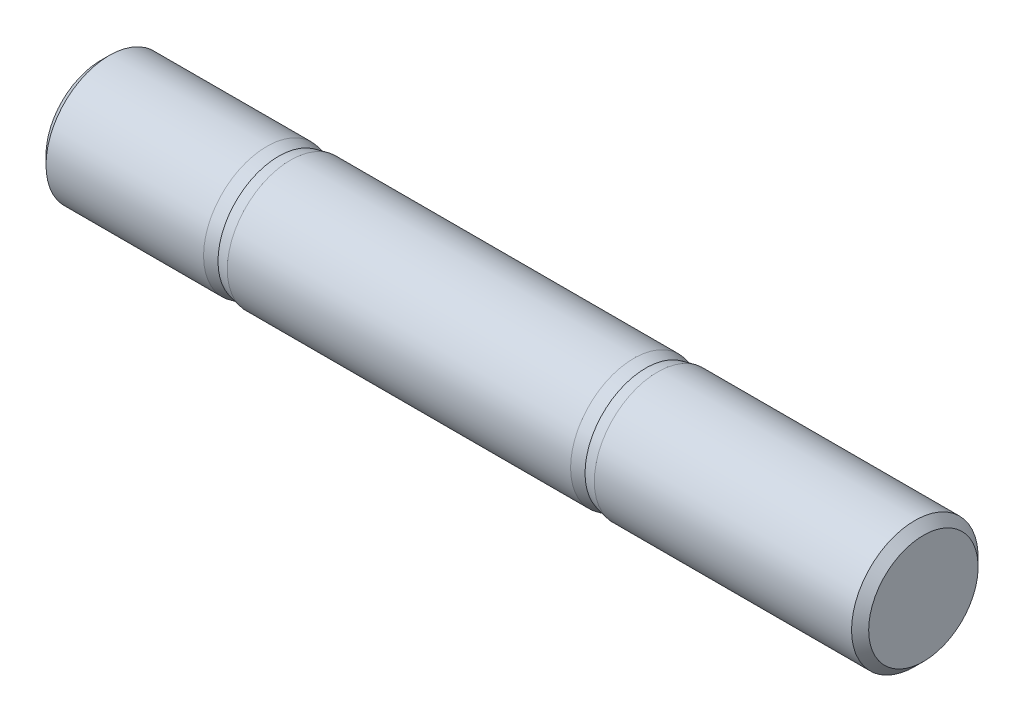
ISO-10303-21;
HEADER;
FILE_DESCRIPTION(('STEP AP214'),'2;1');
FILE_NAME('part.step','',(''),(''),'','','');
FILE_SCHEMA(('AUTOMOTIVE_DESIGN { 1 0 10303 214 1 1 1 1 }'));
ENDSEC;
DATA;
#1=APPLICATION_CONTEXT('core data for automotive mechanical design processes');
#2=APPLICATION_PROTOCOL_DEFINITION('international standard','automotive_design',2000,#1);
#3=PRODUCT_CONTEXT('',#1,'mechanical');
#4=PRODUCT('Part','Part','',(#3));
#5=PRODUCT_RELATED_PRODUCT_CATEGORY('part','',(#4));
#6=PRODUCT_DEFINITION_FORMATION('','',#4);
#7=PRODUCT_DEFINITION_CONTEXT('part definition',#1,'design');
#8=PRODUCT_DEFINITION('design','',#6,#7);
#9=PRODUCT_DEFINITION_SHAPE('','',#8);
#10=(LENGTH_UNIT() NAMED_UNIT(*) SI_UNIT(.MILLI.,.METRE.));
#11=(NAMED_UNIT(*) PLANE_ANGLE_UNIT() SI_UNIT($,.RADIAN.));
#12=(NAMED_UNIT(*) SI_UNIT($,.STERADIAN.) SOLID_ANGLE_UNIT());
#13=UNCERTAINTY_MEASURE_WITH_UNIT(LENGTH_MEASURE(1.E-05),#10,'distance_accuracy_value','');
#14=(GEOMETRIC_REPRESENTATION_CONTEXT(3) GLOBAL_UNCERTAINTY_ASSIGNED_CONTEXT((#13)) GLOBAL_UNIT_ASSIGNED_CONTEXT((#10,
#11,#12)) REPRESENTATION_CONTEXT('',''));
#15=CARTESIAN_POINT('',(0.,0.,0.));
#16=DIRECTION('',(0.,0.,1.));
#17=DIRECTION('',(1.,0.,0.));
#18=AXIS2_PLACEMENT_3D('',#15,#16,#17);
#19=CARTESIAN_POINT('',(30.,0.,0.));
#20=DIRECTION('',(-1.,0.,0.));
#21=DIRECTION('',(0.,0.,1.));
#22=AXIS2_PLACEMENT_3D('',#19,#20,#21);
#23=CONICAL_SURFACE('',#22,9.188,0.213241283902229);
#24=CARTESIAN_POINT('',(26.25,0.,0.));
#25=DIRECTION('',(-1.,0.,0.));
#26=DIRECTION('',(0.,0.,1.));
#27=AXIS2_PLACEMENT_3D('',#24,#25,#26);
#28=CIRCLE('',#27,10.);
#29=CARTESIAN_POINT('',(26.25,0.,10.));
#30=VERTEX_POINT('',#29);
#31=EDGE_CURVE('E56',#30,#30,#28,.T.);
#32=ORIENTED_EDGE('',*,*,#31,.F.);
#33=EDGE_LOOP('',(#32));
#34=FACE_BOUND('',#33,.T.);
#35=CARTESIAN_POINT('',(28.125,0.,0.));
#36=DIRECTION('',(1.,0.,0.));
#37=DIRECTION('',(0.,0.,-1.));
#38=AXIS2_PLACEMENT_3D('',#35,#36,#37);
#39=CIRCLE('',#38,9.594);
#40=CARTESIAN_POINT('',(28.125,0.,-9.594));
#41=VERTEX_POINT('',#40);
#42=EDGE_CURVE('E10',#41,#41,#39,.T.);
#43=ORIENTED_EDGE('',*,*,#42,.F.);
#44=EDGE_LOOP('',(#43));
#45=FACE_BOUND('',#44,.T.);
#46=ADVANCED_FACE('F30',(#34,#45),#23,.T.);
#47=CARTESIAN_POINT('',(0.,0.,0.));
#48=DIRECTION('',(1.,0.,0.));
#49=DIRECTION('',(0.,0.,-1.));
#50=AXIS2_PLACEMENT_3D('',#47,#48,#49);
#51=PLANE('',#50);
#52=CARTESIAN_POINT('',(0.,0.,0.));
#53=DIRECTION('',(1.,0.,0.));
#54=DIRECTION('',(0.,0.,-1.));
#55=AXIS2_PLACEMENT_3D('',#52,#53,#54);
#56=CIRCLE('',#55,8.64700000000004);
#57=CARTESIAN_POINT('',(0.,0.,-8.64700000000004));
#58=VERTEX_POINT('',#57);
#59=EDGE_CURVE('E53',#58,#58,#56,.F.);
#60=ORIENTED_EDGE('',*,*,#59,.T.);
#61=EDGE_LOOP('',(#60));
#62=FACE_BOUND('',#61,.T.);
#63=ADVANCED_FACE('F86',(#62),#51,.F.);
#64=CARTESIAN_POINT('',(-1.31084166351941,0.,0.));
#65=DIRECTION('',(-1.,0.,0.));
#66=DIRECTION('',(0.,0.,1.));
#67=AXIS2_PLACEMENT_3D('',#64,#65,#66);
#68=CYLINDRICAL_SURFACE('',#67,10.);
#69=CARTESIAN_POINT('',(1.35299999999997,0.,0.));
#70=DIRECTION('',(1.,0.,0.));
#71=DIRECTION('',(0.,0.,-1.));
#72=AXIS2_PLACEMENT_3D('',#69,#70,#71);
#73=CIRCLE('',#72,10.);
#74=CARTESIAN_POINT('',(1.35299999999997,0.,-10.));
#75=VERTEX_POINT('',#74);
#76=EDGE_CURVE('E50',#75,#75,#73,.T.);
#77=ORIENTED_EDGE('',*,*,#76,.T.);
#78=EDGE_LOOP('',(#77));
#79=FACE_BOUND('',#78,.T.);
#80=ORIENTED_EDGE('',*,*,#31,.T.);
#81=EDGE_LOOP('',(#80));
#82=FACE_BOUND('',#81,.T.);
#83=ADVANCED_FACE('F92',(#79,#82),#68,.T.);
#84=CARTESIAN_POINT('',(0.,0.,0.));
#85=DIRECTION('',(1.,0.,0.));
#86=DIRECTION('',(0.,0.,-1.));
#87=AXIS2_PLACEMENT_3D('',#84,#85,#86);
#88=CONICAL_SURFACE('',#87,8.64700000000004,0.785398163397443);
#89=ORIENTED_EDGE('',*,*,#76,.F.);
#90=EDGE_LOOP('',(#89));
#91=FACE_BOUND('',#90,.T.);
#92=ORIENTED_EDGE('',*,*,#59,.F.);
#93=EDGE_LOOP('',(#92));
#94=FACE_BOUND('',#93,.T.);
#95=ADVANCED_FACE('F82',(#91,#94),#88,.T.);
#96=CARTESIAN_POINT('',(30.,0.,0.));
#97=DIRECTION('',(1.,0.,0.));
#98=DIRECTION('',(0.,0.,-1.));
#99=AXIS2_PLACEMENT_3D('',#96,#97,#98);
#100=CONICAL_SURFACE('',#99,10.,0.213241283902229);
#101=CARTESIAN_POINT('',(30.,0.,0.));
#102=DIRECTION('',(-1.,0.,0.));
#103=DIRECTION('',(0.,0.,1.));
#104=AXIS2_PLACEMENT_3D('',#101,#102,#103);
#105=CIRCLE('',#104,10.);
#106=CARTESIAN_POINT('',(30.,0.,10.));
#107=VERTEX_POINT('',#106);
#108=EDGE_CURVE('E62',#107,#107,#105,.T.);
#109=ORIENTED_EDGE('',*,*,#108,.T.);
#110=EDGE_LOOP('',(#109));
#111=FACE_BOUND('',#110,.T.);
#112=ORIENTED_EDGE('',*,*,#42,.T.);
#113=EDGE_LOOP('',(#112));
#114=FACE_BOUND('',#113,.T.);
#115=ADVANCED_FACE('F73',(#111,#114),#100,.T.);
#116=CARTESIAN_POINT('',(88.,0.,0.));
#117=DIRECTION('',(-1.,0.,0.));
#118=DIRECTION('',(0.,0.,1.));
#119=AXIS2_PLACEMENT_3D('',#116,#117,#118);
#120=CONICAL_SURFACE('',#119,9.188,0.213241283902229);
#121=CARTESIAN_POINT('',(84.25,0.,0.));
#122=DIRECTION('',(-1.,0.,0.));
#123=DIRECTION('',(0.,0.,1.));
#124=AXIS2_PLACEMENT_3D('',#121,#122,#123);
#125=CIRCLE('',#124,10.);
#126=CARTESIAN_POINT('',(84.25,0.,10.));
#127=VERTEX_POINT('',#126);
#128=EDGE_CURVE('E65',#127,#127,#125,.T.);
#129=ORIENTED_EDGE('',*,*,#128,.F.);
#130=EDGE_LOOP('',(#129));
#131=FACE_BOUND('',#130,.T.);
#132=CARTESIAN_POINT('',(86.125,0.,0.));
#133=DIRECTION('',(-1.,0.,0.));
#134=DIRECTION('',(0.,0.,1.));
#135=AXIS2_PLACEMENT_3D('',#132,#133,#134);
#136=CIRCLE('',#135,9.594);
#137=CARTESIAN_POINT('',(86.125,0.,9.594));
#138=VERTEX_POINT('',#137);
#139=EDGE_CURVE('E37',#138,#138,#136,.T.);
#140=ORIENTED_EDGE('',*,*,#139,.T.);
#141=EDGE_LOOP('',(#140));
#142=FACE_BOUND('',#141,.T.);
#143=ADVANCED_FACE('F71',(#131,#142),#120,.T.);
#144=CARTESIAN_POINT('',(-1.31084166351941,0.,0.));
#145=DIRECTION('',(-1.,0.,0.));
#146=DIRECTION('',(0.,0.,1.));
#147=AXIS2_PLACEMENT_3D('',#144,#145,#146);
#148=CYLINDRICAL_SURFACE('',#147,10.);
#149=ORIENTED_EDGE('',*,*,#108,.F.);
#150=EDGE_LOOP('',(#149));
#151=FACE_BOUND('',#150,.T.);
#152=ORIENTED_EDGE('',*,*,#128,.T.);
#153=EDGE_LOOP('',(#152));
#154=FACE_BOUND('',#153,.T.);
#155=ADVANCED_FACE('F69',(#151,#154),#148,.T.);
#156=CARTESIAN_POINT('',(130.,10.,0.));
#157=DIRECTION('',(-1.,0.,0.));
#158=DIRECTION('',(0.,0.,1.));
#159=AXIS2_PLACEMENT_3D('',#156,#157,#158);
#160=PLANE('',#159);
#161=CARTESIAN_POINT('',(130.,0.,0.));
#162=DIRECTION('',(-1.,0.,0.));
#163=DIRECTION('',(0.,0.,1.));
#164=AXIS2_PLACEMENT_3D('',#161,#162,#163);
#165=CIRCLE('',#164,8.647);
#166=CARTESIAN_POINT('',(130.,0.,8.647));
#167=VERTEX_POINT('',#166);
#168=EDGE_CURVE('E41',#167,#167,#165,.F.);
#169=ORIENTED_EDGE('',*,*,#168,.T.);
#170=EDGE_LOOP('',(#169));
#171=FACE_BOUND('',#170,.T.);
#172=ADVANCED_FACE('F79',(#171),#160,.F.);
#173=CARTESIAN_POINT('',(128.647,0.,0.));
#174=DIRECTION('',(-1.,0.,0.));
#175=DIRECTION('',(0.,0.,1.));
#176=AXIS2_PLACEMENT_3D('',#173,#174,#175);
#177=CONICAL_SURFACE('',#176,10.,0.785398163397441);
#178=ORIENTED_EDGE('',*,*,#168,.F.);
#179=EDGE_LOOP('',(#178));
#180=FACE_BOUND('',#179,.T.);
#181=CARTESIAN_POINT('',(128.647,0.,0.));
#182=DIRECTION('',(-1.,0.,0.));
#183=DIRECTION('',(0.,0.,1.));
#184=AXIS2_PLACEMENT_3D('',#181,#182,#183);
#185=CIRCLE('',#184,10.);
#186=CARTESIAN_POINT('',(128.647,0.,10.));
#187=VERTEX_POINT('',#186);
#188=EDGE_CURVE('E45',#187,#187,#185,.T.);
#189=ORIENTED_EDGE('',*,*,#188,.F.);
#190=EDGE_LOOP('',(#189));
#191=FACE_BOUND('',#190,.T.);
#192=ADVANCED_FACE('F32',(#180,#191),#177,.T.);
#193=CARTESIAN_POINT('',(-1.31084166351941,0.,0.));
#194=DIRECTION('',(-1.,0.,0.));
#195=DIRECTION('',(0.,0.,1.));
#196=AXIS2_PLACEMENT_3D('',#193,#194,#195);
#197=CYLINDRICAL_SURFACE('',#196,10.);
#198=ORIENTED_EDGE('',*,*,#188,.T.);
#199=EDGE_LOOP('',(#198));
#200=FACE_BOUND('',#199,.T.);
#201=CARTESIAN_POINT('',(88.,0.,0.));
#202=DIRECTION('',(-1.,0.,0.));
#203=DIRECTION('',(0.,0.,1.));
#204=AXIS2_PLACEMENT_3D('',#201,#202,#203);
#205=CIRCLE('',#204,10.);
#206=CARTESIAN_POINT('',(88.,0.,10.));
#207=VERTEX_POINT('',#206);
#208=EDGE_CURVE('E59',#207,#207,#205,.T.);
#209=ORIENTED_EDGE('',*,*,#208,.F.);
#210=EDGE_LOOP('',(#209));
#211=FACE_BOUND('',#210,.T.);
#212=ADVANCED_FACE('F140',(#200,#211),#197,.T.);
#213=CARTESIAN_POINT('',(88.,0.,0.));
#214=DIRECTION('',(1.,0.,0.));
#215=DIRECTION('',(0.,0.,-1.));
#216=AXIS2_PLACEMENT_3D('',#213,#214,#215);
#217=CONICAL_SURFACE('',#216,10.,0.213241283902231);
#218=ORIENTED_EDGE('',*,*,#208,.T.);
#219=EDGE_LOOP('',(#218));
#220=FACE_BOUND('',#219,.T.);
#221=ORIENTED_EDGE('',*,*,#139,.F.);
#222=EDGE_LOOP('',(#221));
#223=FACE_BOUND('',#222,.T.);
#224=ADVANCED_FACE('F99',(#220,#223),#217,.T.);
#225=CLOSED_SHELL('',(#46,#63,#83,#95,#115,#143,#155,#172,#192,#212,#224));
#226=MANIFOLD_SOLID_BREP('B2',#225);
#227=ADVANCED_BREP_SHAPE_REPRESENTATION('',(#18,#226),#14);
#228=SHAPE_DEFINITION_REPRESENTATION(#9,#227);
ENDSEC;
END-ISO-10303-21;
